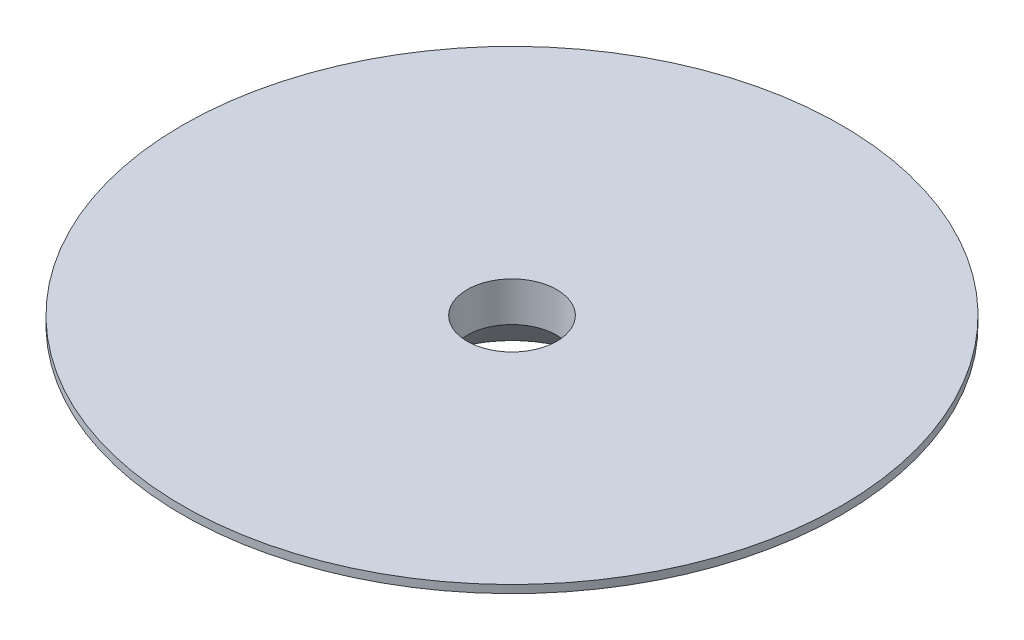
ISO-10303-21;
HEADER;
FILE_DESCRIPTION(('STEP AP214'),'2;1');
FILE_NAME('part.step','',(''),(''),'','','');
FILE_SCHEMA(('AUTOMOTIVE_DESIGN { 1 0 10303 214 1 1 1 1 }'));
ENDSEC;
DATA;
#1=APPLICATION_CONTEXT('core data for automotive mechanical design processes');
#2=APPLICATION_PROTOCOL_DEFINITION('international standard','automotive_design',2000,#1);
#3=PRODUCT_CONTEXT('',#1,'mechanical');
#4=PRODUCT('Part','Part','',(#3));
#5=PRODUCT_RELATED_PRODUCT_CATEGORY('part','',(#4));
#6=PRODUCT_DEFINITION_FORMATION('','',#4);
#7=PRODUCT_DEFINITION_CONTEXT('part definition',#1,'design');
#8=PRODUCT_DEFINITION('design','',#6,#7);
#9=PRODUCT_DEFINITION_SHAPE('','',#8);
#10=(LENGTH_UNIT() NAMED_UNIT(*) SI_UNIT(.MILLI.,.METRE.));
#11=(NAMED_UNIT(*) PLANE_ANGLE_UNIT() SI_UNIT($,.RADIAN.));
#12=(NAMED_UNIT(*) SI_UNIT($,.STERADIAN.) SOLID_ANGLE_UNIT());
#13=UNCERTAINTY_MEASURE_WITH_UNIT(LENGTH_MEASURE(1.E-05),#10,'distance_accuracy_value','');
#14=(GEOMETRIC_REPRESENTATION_CONTEXT(3) GLOBAL_UNCERTAINTY_ASSIGNED_CONTEXT((#13)) GLOBAL_UNIT_ASSIGNED_CONTEXT((#10,
#11,#12)) REPRESENTATION_CONTEXT('',''));
#15=CARTESIAN_POINT('',(0.,0.,0.));
#16=DIRECTION('',(0.,0.,1.));
#17=DIRECTION('',(1.,0.,0.));
#18=AXIS2_PLACEMENT_3D('',#15,#16,#17);
#19=CARTESIAN_POINT('',(0.,-3.3,0.));
#20=DIRECTION('',(0.,1.,0.));
#21=DIRECTION('',(-1.,0.,0.));
#22=AXIS2_PLACEMENT_3D('',#19,#20,#21);
#23=PLANE('',#22);
#24=CARTESIAN_POINT('',(0.,-3.3,0.));
#25=DIRECTION('',(0.,-1.,0.));
#26=DIRECTION('',(0.,0.,-1.));
#27=AXIS2_PLACEMENT_3D('',#24,#25,#26);
#28=CIRCLE('',#27,3.5);
#29=CARTESIAN_POINT('',(0.,-3.3,-3.5));
#30=VERTEX_POINT('',#29);
#31=EDGE_CURVE('E58',#30,#30,#28,.T.);
#32=ORIENTED_EDGE('',*,*,#31,.F.);
#33=EDGE_LOOP('',(#32));
#34=FACE_BOUND('',#33,.T.);
#35=CARTESIAN_POINT('',(0.,-3.3,0.));
#36=DIRECTION('',(0.,1.,0.));
#37=DIRECTION('',(-1.,0.,0.));
#38=AXIS2_PLACEMENT_3D('',#35,#36,#37);
#39=CIRCLE('',#38,5.06256809098383);
#40=CARTESIAN_POINT('',(-5.06256809098383,-3.3,0.));
#41=VERTEX_POINT('',#40);
#42=EDGE_CURVE('E10',#41,#41,#39,.F.);
#43=ORIENTED_EDGE('',*,*,#42,.T.);
#44=EDGE_LOOP('',(#43));
#45=FACE_BOUND('',#44,.T.);
#46=ADVANCED_FACE('F32',(#34,#45),#23,.F.);
#47=CARTESIAN_POINT('',(0.,-3.3,0.));
#48=DIRECTION('',(0.,1.,0.));
#49=DIRECTION('',(-1.,0.,0.));
#50=AXIS2_PLACEMENT_3D('',#47,#48,#49);
#51=CONICAL_SURFACE('',#50,8.21555597977367,0.95993108859688);
#52=CARTESIAN_POINT('',(0.,-1.49152044288991,0.));
#53=DIRECTION('',(0.,-1.,0.));
#54=DIRECTION('',(1.,0.,0.));
#55=AXIS2_PLACEMENT_3D('',#52,#53,#54);
#56=CIRCLE('',#55,10.7983324544943);
#57=CARTESIAN_POINT('',(10.7983324544943,-1.49152044288991,0.));
#58=VERTEX_POINT('',#57);
#59=EDGE_CURVE('E39',#58,#58,#56,.F.);
#60=ORIENTED_EDGE('',*,*,#59,.T.);
#61=EDGE_LOOP('',(#60));
#62=FACE_BOUND('',#61,.T.);
#63=CARTESIAN_POINT('',(0.,-0.300000000000001,0.));
#64=DIRECTION('',(0.,1.,0.));
#65=DIRECTION('',(-1.,0.,0.));
#66=AXIS2_PLACEMENT_3D('',#63,#64,#65);
#67=CIRCLE('',#66,12.5);
#68=CARTESIAN_POINT('',(-12.5,-0.300000000000003,0.));
#69=VERTEX_POINT('',#68);
#70=EDGE_CURVE('E43',#69,#69,#67,.T.);
#71=ORIENTED_EDGE('',*,*,#70,.F.);
#72=EDGE_LOOP('',(#71));
#73=FACE_BOUND('',#72,.T.);
#74=ADVANCED_FACE('F65',(#62,#73),#51,.T.);
#75=CARTESIAN_POINT('',(0.,0.,0.));
#76=DIRECTION('',(0.,1.,0.));
#77=DIRECTION('',(-1.,0.,0.));
#78=AXIS2_PLACEMENT_3D('',#75,#76,#77);
#79=CYLINDRICAL_SURFACE('',#78,12.5);
#80=CARTESIAN_POINT('',(0.,0.,0.));
#81=DIRECTION('',(0.,1.,0.));
#82=DIRECTION('',(-1.,0.,0.));
#83=AXIS2_PLACEMENT_3D('',#80,#81,#82);
#84=CIRCLE('',#83,12.5);
#85=CARTESIAN_POINT('',(-12.5,0.,0.));
#86=VERTEX_POINT('',#85);
#87=EDGE_CURVE('E47',#86,#86,#84,.T.);
#88=ORIENTED_EDGE('',*,*,#87,.F.);
#89=EDGE_LOOP('',(#88));
#90=FACE_BOUND('',#89,.T.);
#91=ORIENTED_EDGE('',*,*,#70,.T.);
#92=EDGE_LOOP('',(#91));
#93=FACE_BOUND('',#92,.T.);
#94=ADVANCED_FACE('F69',(#90,#93),#79,.T.);
#95=CARTESIAN_POINT('',(12.5,0.,0.));
#96=DIRECTION('',(0.,-1.,0.));
#97=DIRECTION('',(1.,0.,0.));
#98=AXIS2_PLACEMENT_3D('',#95,#96,#97);
#99=PLANE('',#98);
#100=CARTESIAN_POINT('',(0.,0.,0.));
#101=DIRECTION('',(0.,-1.,0.));
#102=DIRECTION('',(0.,0.,-1.));
#103=AXIS2_PLACEMENT_3D('',#100,#101,#102);
#104=CIRCLE('',#103,1.7);
#105=CARTESIAN_POINT('',(0.,0.,-1.7));
#106=VERTEX_POINT('',#105);
#107=EDGE_CURVE('E52',#106,#106,#104,.T.);
#108=ORIENTED_EDGE('',*,*,#107,.T.);
#109=EDGE_LOOP('',(#108));
#110=FACE_BOUND('',#109,.T.);
#111=ORIENTED_EDGE('',*,*,#87,.T.);
#112=EDGE_LOOP('',(#111));
#113=FACE_BOUND('',#112,.T.);
#114=ADVANCED_FACE('F74',(#110,#113),#99,.F.);
#115=CARTESIAN_POINT('',(0.,6.7,0.));
#116=DIRECTION('',(0.,1.,0.));
#117=DIRECTION('',(-1.,0.,0.));
#118=AXIS2_PLACEMENT_3D('',#115,#116,#117);
#119=DEGENERATE_TOROIDAL_SURFACE('',#118,5.06256809098383,10.,.T.);
#120=ORIENTED_EDGE('',*,*,#42,.F.);
#121=EDGE_LOOP('',(#120));
#122=FACE_BOUND('',#121,.T.);
#123=ORIENTED_EDGE('',*,*,#59,.F.);
#124=EDGE_LOOP('',(#123));
#125=FACE_BOUND('',#124,.T.);
#126=ADVANCED_FACE('F34',(#122,#125),#119,.T.);
#127=CARTESIAN_POINT('',(0.,-3.3,0.));
#128=DIRECTION('',(0.,-1.,0.));
#129=DIRECTION('',(0.,0.,-1.));
#130=AXIS2_PLACEMENT_3D('',#127,#128,#129);
#131=CYLINDRICAL_SURFACE('',#130,1.7);
#132=ORIENTED_EDGE('',*,*,#107,.F.);
#133=EDGE_LOOP('',(#132));
#134=FACE_BOUND('',#133,.T.);
#135=CARTESIAN_POINT('',(0.,-1.5,0.));
#136=DIRECTION('',(0.,-1.,0.));
#137=DIRECTION('',(0.,0.,-1.));
#138=AXIS2_PLACEMENT_3D('',#135,#136,#137);
#139=CIRCLE('',#138,1.7);
#140=CARTESIAN_POINT('',(0.,-1.5,-1.7));
#141=VERTEX_POINT('',#140);
#142=EDGE_CURVE('E55',#141,#141,#139,.T.);
#143=ORIENTED_EDGE('',*,*,#142,.T.);
#144=EDGE_LOOP('',(#143));
#145=FACE_BOUND('',#144,.T.);
#146=ADVANCED_FACE('F79',(#134,#145),#131,.F.);
#147=CARTESIAN_POINT('',(0.,-3.3,0.));
#148=DIRECTION('',(0.,-1.,0.));
#149=DIRECTION('',(0.,0.,-1.));
#150=AXIS2_PLACEMENT_3D('',#147,#148,#149);
#151=CONICAL_SURFACE('',#150,3.5,0.785398163397449);
#152=ORIENTED_EDGE('',*,*,#142,.F.);
#153=EDGE_LOOP('',(#152));
#154=FACE_BOUND('',#153,.T.);
#155=ORIENTED_EDGE('',*,*,#31,.T.);
#156=EDGE_LOOP('',(#155));
#157=FACE_BOUND('',#156,.T.);
#158=ADVANCED_FACE('F62',(#154,#157),#151,.F.);
#159=CLOSED_SHELL('',(#46,#74,#94,#114,#126,#146,#158));
#160=MANIFOLD_SOLID_BREP('B2',#159);
#161=ADVANCED_BREP_SHAPE_REPRESENTATION('',(#18,#160),#14);
#162=SHAPE_DEFINITION_REPRESENTATION(#9,#161);
ENDSEC;
END-ISO-10303-21;
